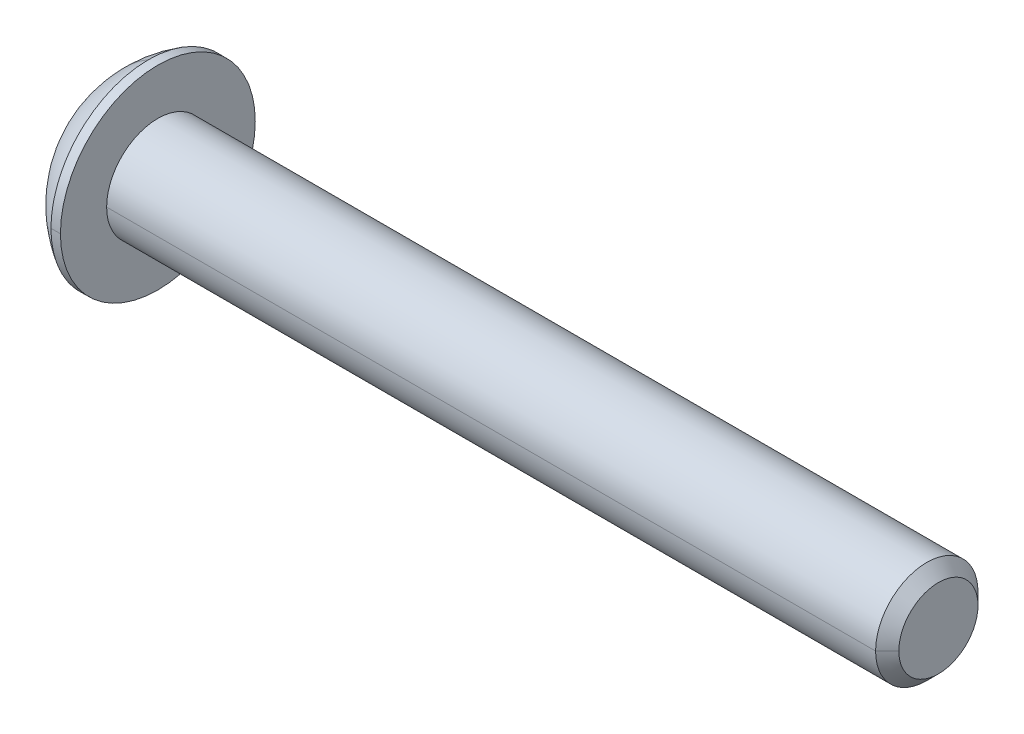
ISO-10303-21;
HEADER;
FILE_DESCRIPTION(('STEP AP214'),'2;1');
FILE_NAME('part.step','',(''),(''),'','','');
FILE_SCHEMA(('AUTOMOTIVE_DESIGN { 1 0 10303 214 1 1 1 1 }'));
ENDSEC;
DATA;
#1=APPLICATION_CONTEXT('core data for automotive mechanical design processes');
#2=APPLICATION_PROTOCOL_DEFINITION('international standard','automotive_design',2000,#1);
#3=PRODUCT_CONTEXT('',#1,'mechanical');
#4=PRODUCT('Part','Part','',(#3));
#5=PRODUCT_RELATED_PRODUCT_CATEGORY('part','',(#4));
#6=PRODUCT_DEFINITION_FORMATION('','',#4);
#7=PRODUCT_DEFINITION_CONTEXT('part definition',#1,'design');
#8=PRODUCT_DEFINITION('design','',#6,#7);
#9=PRODUCT_DEFINITION_SHAPE('','',#8);
#10=(LENGTH_UNIT() NAMED_UNIT(*) SI_UNIT(.MILLI.,.METRE.));
#11=(NAMED_UNIT(*) PLANE_ANGLE_UNIT() SI_UNIT($,.RADIAN.));
#12=(NAMED_UNIT(*) SI_UNIT($,.STERADIAN.) SOLID_ANGLE_UNIT());
#13=UNCERTAINTY_MEASURE_WITH_UNIT(LENGTH_MEASURE(1.E-05),#10,'distance_accuracy_value','');
#14=(GEOMETRIC_REPRESENTATION_CONTEXT(3) GLOBAL_UNCERTAINTY_ASSIGNED_CONTEXT((#13)) GLOBAL_UNIT_ASSIGNED_CONTEXT((#10,
#11,#12)) REPRESENTATION_CONTEXT('',''));
#15=CARTESIAN_POINT('',(0.,0.,0.));
#16=DIRECTION('',(0.,0.,1.));
#17=DIRECTION('',(1.,0.,0.));
#18=AXIS2_PLACEMENT_3D('',#15,#16,#17);
#19=CARTESIAN_POINT('',(-997.989959248641,0.,0.));
#20=DIRECTION('',(-1.,0.,0.));
#21=DIRECTION('',(0.,0.,1.));
#22=AXIS2_PLACEMENT_3D('',#19,#20,#21);
#23=CONICAL_SURFACE('',#22,1732.05080756886,1.0471975511966);
#24=DIRECTION('',(-0.5,0.,0.866025403784436));
#25=VECTOR('',#24,1.);
#26=CARTESIAN_POINT('',(2.01004075135859,0.,0.));
#27=LINE('',#26,#25);
#28=CARTESIAN_POINT('',(2.01004075135859,0.,0.));
#29=VERTEX_POINT('',#28);
#30=CARTESIAN_POINT('',(1.3208,0.,1.1938));
#31=VERTEX_POINT('',#30);
#32=EDGE_CURVE('E39',#29,#31,#27,.T.);
#33=ORIENTED_EDGE('',*,*,#32,.F.);
#34=DIRECTION('',(-0.5,0.,-0.866025403784436));
#35=VECTOR('',#34,1.);
#36=CARTESIAN_POINT('',(2.01004075135859,0.,0.));
#37=LINE('',#36,#35);
#38=CARTESIAN_POINT('',(1.3208,0.,-1.1938));
#39=VERTEX_POINT('',#38);
#40=EDGE_CURVE('E11',#29,#39,#37,.T.);
#41=ORIENTED_EDGE('',*,*,#40,.T.);
#42=CARTESIAN_POINT('',(1.3208,0.,0.));
#43=DIRECTION('',(-1.,0.,0.));
#44=DIRECTION('',(0.,0.,1.));
#45=AXIS2_PLACEMENT_3D('',#42,#43,#44);
#46=CIRCLE('',#45,1.1938);
#47=CARTESIAN_POINT('',(1.3208,-1.03386112703786,-0.5969));
#48=VERTEX_POINT('',#47);
#49=EDGE_CURVE('E26',#39,#48,#46,.T.);
#50=ORIENTED_EDGE('',*,*,#49,.T.);
#51=CARTESIAN_POINT('',(1.3208,0.,0.));
#52=DIRECTION('',(-1.,0.,0.));
#53=DIRECTION('',(0.,0.,1.));
#54=AXIS2_PLACEMENT_3D('',#51,#52,#53);
#55=CIRCLE('',#54,1.1938);
#56=CARTESIAN_POINT('',(1.3208,-1.03386112703786,0.5969));
#57=VERTEX_POINT('',#56);
#58=EDGE_CURVE('E199',#48,#57,#55,.T.);
#59=ORIENTED_EDGE('',*,*,#58,.T.);
#60=CARTESIAN_POINT('',(1.3208,0.,0.));
#61=DIRECTION('',(-1.,0.,0.));
#62=DIRECTION('',(0.,0.,1.));
#63=AXIS2_PLACEMENT_3D('',#60,#61,#62);
#64=CIRCLE('',#63,1.1938);
#65=EDGE_CURVE('E196',#57,#31,#64,.T.);
#66=ORIENTED_EDGE('',*,*,#65,.T.);
#67=EDGE_LOOP('',(#33,#41,#50,#59,#66));
#68=FACE_BOUND('',#67,.T.);
#69=ADVANCED_FACE('F16',(#68),#23,.F.);
#70=CARTESIAN_POINT('',(33.9598,0.,0.));
#71=DIRECTION('',(-1.,0.,0.));
#72=DIRECTION('',(0.,0.,1.));
#73=AXIS2_PLACEMENT_3D('',#70,#71,#72);
#74=CONICAL_SURFACE('',#73,1.61036,0.785398163397453);
#75=CARTESIAN_POINT('',(33.9598,0.,0.));
#76=DIRECTION('',(-1.,0.,0.));
#77=DIRECTION('',(0.,0.,1.));
#78=AXIS2_PLACEMENT_3D('',#75,#76,#77);
#79=CIRCLE('',#78,1.61036);
#80=CARTESIAN_POINT('',(33.9598,0.,1.61036));
#81=VERTEX_POINT('',#80);
#82=CARTESIAN_POINT('',(33.9598,0.,-1.61036));
#83=VERTEX_POINT('',#82);
#84=EDGE_CURVE('E200',#81,#83,#79,.T.);
#85=ORIENTED_EDGE('',*,*,#84,.T.);
#86=DIRECTION('',(-0.707106781186544,0.,-0.707106781186552));
#87=VECTOR('',#86,1.);
#88=CARTESIAN_POINT('',(33.9598,0.,-1.61036));
#89=LINE('',#88,#87);
#90=CARTESIAN_POINT('',(33.48736,0.,-2.0828));
#91=VERTEX_POINT('',#90);
#92=EDGE_CURVE('E284',#83,#91,#89,.T.);
#93=ORIENTED_EDGE('',*,*,#92,.T.);
#94=CARTESIAN_POINT('',(33.48736,0.,0.));
#95=DIRECTION('',(-1.,0.,0.));
#96=DIRECTION('',(0.,0.,1.));
#97=AXIS2_PLACEMENT_3D('',#94,#95,#96);
#98=CIRCLE('',#97,2.0828);
#99=CARTESIAN_POINT('',(33.48736,0.,2.0828));
#100=VERTEX_POINT('',#99);
#101=EDGE_CURVE('E246',#100,#91,#98,.T.);
#102=ORIENTED_EDGE('',*,*,#101,.F.);
#103=DIRECTION('',(-0.707106781186544,0.,0.707106781186552));
#104=VECTOR('',#103,1.);
#105=CARTESIAN_POINT('',(33.9598,0.,1.61036));
#106=LINE('',#105,#104);
#107=EDGE_CURVE('E267',#81,#100,#106,.T.);
#108=ORIENTED_EDGE('',*,*,#107,.F.);
#109=EDGE_LOOP('',(#85,#93,#102,#108));
#110=FACE_BOUND('',#109,.T.);
#111=ADVANCED_FACE('F568',(#110),#74,.T.);
#112=CARTESIAN_POINT('',(0.,0.,0.));
#113=DIRECTION('',(-1.,0.,0.));
#114=DIRECTION('',(0.,0.,1.));
#115=AXIS2_PLACEMENT_3D('',#112,#113,#114);
#116=CYLINDRICAL_SURFACE('',#115,2.0828);
#117=ORIENTED_EDGE('',*,*,#101,.T.);
#118=DIRECTION('',(-1.,0.,0.));
#119=VECTOR('',#118,1.);
#120=CARTESIAN_POINT('',(0.,0.,-2.0828));
#121=LINE('',#120,#119);
#122=CARTESIAN_POINT('',(2.2098,0.,-2.0828));
#123=VERTEX_POINT('',#122);
#124=EDGE_CURVE('E242',#91,#123,#121,.T.);
#125=ORIENTED_EDGE('',*,*,#124,.T.);
#126=CARTESIAN_POINT('',(2.2098,0.,0.));
#127=DIRECTION('',(-1.,0.,0.));
#128=DIRECTION('',(0.,0.,1.));
#129=AXIS2_PLACEMENT_3D('',#126,#127,#128);
#130=CIRCLE('',#129,2.0828);
#131=CARTESIAN_POINT('',(2.2098,0.,2.0828));
#132=VERTEX_POINT('',#131);
#133=EDGE_CURVE('E238',#132,#123,#130,.T.);
#134=ORIENTED_EDGE('',*,*,#133,.F.);
#135=DIRECTION('',(-1.,0.,0.));
#136=VECTOR('',#135,1.);
#137=CARTESIAN_POINT('',(0.,0.,2.0828));
#138=LINE('',#137,#136);
#139=EDGE_CURVE('E266',#100,#132,#138,.T.);
#140=ORIENTED_EDGE('',*,*,#139,.F.);
#141=EDGE_LOOP('',(#117,#125,#134,#140));
#142=FACE_BOUND('',#141,.T.);
#143=ADVANCED_FACE('F563',(#142),#116,.T.);
#144=CARTESIAN_POINT('',(0.,0.,0.));
#145=DIRECTION('',(-1.,0.,0.));
#146=DIRECTION('',(0.,0.,1.));
#147=AXIS2_PLACEMENT_3D('',#144,#145,#146);
#148=CYLINDRICAL_SURFACE('',#147,3.9624);
#149=CARTESIAN_POINT('',(2.2098,0.,0.));
#150=DIRECTION('',(-1.,0.,0.));
#151=DIRECTION('',(0.,0.,1.));
#152=AXIS2_PLACEMENT_3D('',#149,#150,#151);
#153=CIRCLE('',#152,3.9624);
#154=CARTESIAN_POINT('',(2.2098,0.,3.9624));
#155=VERTEX_POINT('',#154);
#156=CARTESIAN_POINT('',(2.2098,0.,-3.9624));
#157=VERTEX_POINT('',#156);
#158=EDGE_CURVE('E247',#155,#157,#153,.T.);
#159=ORIENTED_EDGE('',*,*,#158,.T.);
#160=DIRECTION('',(-1.,0.,0.));
#161=VECTOR('',#160,1.);
#162=CARTESIAN_POINT('',(0.,0.,-3.9624));
#163=LINE('',#162,#161);
#164=CARTESIAN_POINT('',(1.8288,0.,-3.9624));
#165=VERTEX_POINT('',#164);
#166=EDGE_CURVE('E275',#157,#165,#163,.T.);
#167=ORIENTED_EDGE('',*,*,#166,.T.);
#168=CARTESIAN_POINT('',(1.8288,0.,0.));
#169=DIRECTION('',(-1.,0.,0.));
#170=DIRECTION('',(0.,0.,1.));
#171=AXIS2_PLACEMENT_3D('',#168,#169,#170);
#172=CIRCLE('',#171,3.9624);
#173=CARTESIAN_POINT('',(1.8288,3.9624,0.));
#174=VERTEX_POINT('',#173);
#175=EDGE_CURVE('E272',#174,#165,#172,.T.);
#176=ORIENTED_EDGE('',*,*,#175,.F.);
#177=CARTESIAN_POINT('',(1.8288,0.,0.));
#178=DIRECTION('',(-1.,0.,0.));
#179=DIRECTION('',(0.,0.,1.));
#180=AXIS2_PLACEMENT_3D('',#177,#178,#179);
#181=CIRCLE('',#180,3.9624);
#182=CARTESIAN_POINT('',(1.8288,0.,3.9624));
#183=VERTEX_POINT('',#182);
#184=EDGE_CURVE('E259',#183,#174,#181,.T.);
#185=ORIENTED_EDGE('',*,*,#184,.F.);
#186=DIRECTION('',(-1.,0.,0.));
#187=VECTOR('',#186,1.);
#188=CARTESIAN_POINT('',(0.,0.,3.9624));
#189=LINE('',#188,#187);
#190=EDGE_CURVE('E226',#155,#183,#189,.T.);
#191=ORIENTED_EDGE('',*,*,#190,.F.);
#192=EDGE_LOOP('',(#159,#167,#176,#185,#191));
#193=FACE_BOUND('',#192,.T.);
#194=ADVANCED_FACE('F303',(#193),#148,.T.);
#195=CARTESIAN_POINT('',(4.13385,0.,0.));
#196=DIRECTION('',(0.,0.,-1.));
#197=DIRECTION('',(0.,1.,0.));
#198=AXIS2_PLACEMENT_3D('',#195,#196,#197);
#199=SPHERICAL_SURFACE('',#198,4.5840887057844);
#200=ORIENTED_EDGE('',*,*,#175,.T.);
#201=CARTESIAN_POINT('',(1.8288,0.,0.));
#202=DIRECTION('',(-1.,0.,0.));
#203=DIRECTION('',(0.,0.,1.));
#204=AXIS2_PLACEMENT_3D('',#201,#202,#203);
#205=CIRCLE('',#204,3.9624);
#206=CARTESIAN_POINT('',(1.8288,-3.9624,0.));
#207=VERTEX_POINT('',#206);
#208=EDGE_CURVE('E276',#165,#207,#205,.T.);
#209=ORIENTED_EDGE('',*,*,#208,.T.);
#210=CARTESIAN_POINT('',(4.13385,0.,0.));
#211=DIRECTION('',(0.,0.,-1.));
#212=DIRECTION('',(0.,1.,0.));
#213=AXIS2_PLACEMENT_3D('',#210,#211,#212);
#214=CIRCLE('',#213,4.5840887057844);
#215=CARTESIAN_POINT('',(0.,-1.9812,0.));
#216=VERTEX_POINT('',#215);
#217=EDGE_CURVE('E308',#207,#216,#214,.T.);
#218=ORIENTED_EDGE('',*,*,#217,.T.);
#219=CARTESIAN_POINT('',(0.,0.,0.));
#220=DIRECTION('',(-1.,0.,0.));
#221=DIRECTION('',(0.,0.,1.));
#222=AXIS2_PLACEMENT_3D('',#219,#220,#221);
#223=CIRCLE('',#222,1.9812);
#224=CARTESIAN_POINT('',(0.,1.9812,0.));
#225=VERTEX_POINT('',#224);
#226=EDGE_CURVE('E112',#225,#216,#223,.T.);
#227=ORIENTED_EDGE('',*,*,#226,.F.);
#228=CARTESIAN_POINT('',(4.13385,0.,0.));
#229=DIRECTION('',(0.,0.,1.));
#230=DIRECTION('',(1.,0.,0.));
#231=AXIS2_PLACEMENT_3D('',#228,#229,#230);
#232=CIRCLE('',#231,4.5840887057844);
#233=EDGE_CURVE('E102',#174,#225,#232,.T.);
#234=ORIENTED_EDGE('',*,*,#233,.F.);
#235=EDGE_LOOP('',(#200,#209,#218,#227,#234));
#236=FACE_BOUND('',#235,.T.);
#237=ADVANCED_FACE('F313',(#236),#199,.T.);
#238=CARTESIAN_POINT('',(0.,0.,0.));
#239=DIRECTION('',(-1.,0.,0.));
#240=DIRECTION('',(0.,0.,1.));
#241=AXIS2_PLACEMENT_3D('',#238,#239,#240);
#242=PLANE('',#241);
#243=ORIENTED_EDGE('',*,*,#226,.T.);
#244=CARTESIAN_POINT('',(0.,0.,0.));
#245=DIRECTION('',(-1.,0.,0.));
#246=DIRECTION('',(0.,0.,1.));
#247=AXIS2_PLACEMENT_3D('',#244,#245,#246);
#248=CIRCLE('',#247,1.9812);
#249=EDGE_CURVE('E248',#216,#225,#248,.T.);
#250=ORIENTED_EDGE('',*,*,#249,.T.);
#251=EDGE_LOOP('',(#243,#250));
#252=FACE_BOUND('',#251,.T.);
#253=DIRECTION('',(0.,-1.,0.));
#254=VECTOR('',#253,1.);
#255=CARTESIAN_POINT('',(0.,-0.689240751358575,1.1938));
#256=LINE('',#255,#254);
#257=CARTESIAN_POINT('',(0.,0.689240751358575,1.1938));
#258=VERTEX_POINT('',#257);
#259=CARTESIAN_POINT('',(0.,-0.689240751358575,1.1938));
#260=VERTEX_POINT('',#259);
#261=EDGE_CURVE('E170',#258,#260,#256,.T.);
#262=ORIENTED_EDGE('',*,*,#261,.T.);
#263=DIRECTION('',(0.,-0.5,-0.866025403784439));
#264=VECTOR('',#263,1.);
#265=CARTESIAN_POINT('',(0.,-1.37848150271715,0.));
#266=LINE('',#265,#264);
#267=CARTESIAN_POINT('',(0.,-1.37848150271715,0.));
#268=VERTEX_POINT('',#267);
#269=EDGE_CURVE('E220',#260,#268,#266,.T.);
#270=ORIENTED_EDGE('',*,*,#269,.T.);
#271=DIRECTION('',(0.,0.5,-0.866025403784439));
#272=VECTOR('',#271,1.);
#273=CARTESIAN_POINT('',(0.,-0.689240751358575,-1.1938));
#274=LINE('',#273,#272);
#275=CARTESIAN_POINT('',(0.,-0.689240751358575,-1.1938));
#276=VERTEX_POINT('',#275);
#277=EDGE_CURVE('E216',#268,#276,#274,.T.);
#278=ORIENTED_EDGE('',*,*,#277,.T.);
#279=DIRECTION('',(0.,1.,0.));
#280=VECTOR('',#279,1.);
#281=CARTESIAN_POINT('',(0.,0.689240751358575,-1.1938));
#282=LINE('',#281,#280);
#283=CARTESIAN_POINT('',(0.,0.689240751358575,-1.1938));
#284=VERTEX_POINT('',#283);
#285=EDGE_CURVE('E221',#276,#284,#282,.T.);
#286=ORIENTED_EDGE('',*,*,#285,.T.);
#287=DIRECTION('',(0.,0.5,0.866025403784439));
#288=VECTOR('',#287,1.);
#289=CARTESIAN_POINT('',(0.,1.37848150271715,0.));
#290=LINE('',#289,#288);
#291=CARTESIAN_POINT('',(0.,1.37848150271715,0.));
#292=VERTEX_POINT('',#291);
#293=EDGE_CURVE('E283',#284,#292,#290,.T.);
#294=ORIENTED_EDGE('',*,*,#293,.T.);
#295=DIRECTION('',(0.,-0.5,0.866025403784439));
#296=VECTOR('',#295,1.);
#297=CARTESIAN_POINT('',(0.,0.689240751358575,1.1938));
#298=LINE('',#297,#296);
#299=EDGE_CURVE('E258',#292,#258,#298,.T.);
#300=ORIENTED_EDGE('',*,*,#299,.T.);
#301=EDGE_LOOP('',(#262,#270,#278,#286,#294,#300));
#302=FACE_BOUND('',#301,.T.);
#303=ADVANCED_FACE('F373',(#252,#302),#242,.T.);
#304=CARTESIAN_POINT('',(4.13385,0.,0.));
#305=DIRECTION('',(0.,0.,-1.));
#306=DIRECTION('',(0.,1.,0.));
#307=AXIS2_PLACEMENT_3D('',#304,#305,#306);
#308=SPHERICAL_SURFACE('',#307,4.5840887057844);
#309=ORIENTED_EDGE('',*,*,#217,.F.);
#310=CARTESIAN_POINT('',(1.8288,0.,0.));
#311=DIRECTION('',(-1.,0.,0.));
#312=DIRECTION('',(0.,0.,1.));
#313=AXIS2_PLACEMENT_3D('',#310,#311,#312);
#314=CIRCLE('',#313,3.9624);
#315=EDGE_CURVE('E254',#207,#183,#314,.T.);
#316=ORIENTED_EDGE('',*,*,#315,.T.);
#317=ORIENTED_EDGE('',*,*,#184,.T.);
#318=ORIENTED_EDGE('',*,*,#233,.T.);
#319=ORIENTED_EDGE('',*,*,#249,.F.);
#320=EDGE_LOOP('',(#309,#316,#317,#318,#319));
#321=FACE_BOUND('',#320,.T.);
#322=ADVANCED_FACE('F307',(#321),#308,.T.);
#323=CARTESIAN_POINT('',(0.,0.,0.));
#324=DIRECTION('',(-1.,0.,0.));
#325=DIRECTION('',(0.,0.,1.));
#326=AXIS2_PLACEMENT_3D('',#323,#324,#325);
#327=CYLINDRICAL_SURFACE('',#326,3.9624);
#328=ORIENTED_EDGE('',*,*,#166,.F.);
#329=CARTESIAN_POINT('',(2.2098,0.,0.));
#330=DIRECTION('',(-1.,0.,0.));
#331=DIRECTION('',(0.,0.,1.));
#332=AXIS2_PLACEMENT_3D('',#329,#330,#331);
#333=CIRCLE('',#332,3.9624);
#334=EDGE_CURVE('E222',#157,#155,#333,.T.);
#335=ORIENTED_EDGE('',*,*,#334,.T.);
#336=ORIENTED_EDGE('',*,*,#190,.T.);
#337=ORIENTED_EDGE('',*,*,#315,.F.);
#338=ORIENTED_EDGE('',*,*,#208,.F.);
#339=EDGE_LOOP('',(#328,#335,#336,#337,#338));
#340=FACE_BOUND('',#339,.T.);
#341=ADVANCED_FACE('F296',(#340),#327,.T.);
#342=CARTESIAN_POINT('',(2.2098,2.0828,0.));
#343=DIRECTION('',(-1.,0.,0.));
#344=DIRECTION('',(0.,0.,1.));
#345=AXIS2_PLACEMENT_3D('',#342,#343,#344);
#346=PLANE('',#345);
#347=ORIENTED_EDGE('',*,*,#158,.F.);
#348=ORIENTED_EDGE('',*,*,#334,.F.);
#349=EDGE_LOOP('',(#347,#348));
#350=FACE_BOUND('',#349,.T.);
#351=ORIENTED_EDGE('',*,*,#133,.T.);
#352=CARTESIAN_POINT('',(2.2098,0.,0.));
#353=DIRECTION('',(-1.,0.,0.));
#354=DIRECTION('',(0.,0.,1.));
#355=AXIS2_PLACEMENT_3D('',#352,#353,#354);
#356=CIRCLE('',#355,2.0828);
#357=EDGE_CURVE('E241',#123,#132,#356,.T.);
#358=ORIENTED_EDGE('',*,*,#357,.T.);
#359=EDGE_LOOP('',(#351,#358));
#360=FACE_BOUND('',#359,.T.);
#361=ADVANCED_FACE('F554',(#350,#360),#346,.F.);
#362=CARTESIAN_POINT('',(0.,0.,0.));
#363=DIRECTION('',(-1.,0.,0.));
#364=DIRECTION('',(0.,0.,1.));
#365=AXIS2_PLACEMENT_3D('',#362,#363,#364);
#366=CYLINDRICAL_SURFACE('',#365,2.0828);
#367=ORIENTED_EDGE('',*,*,#124,.F.);
#368=CARTESIAN_POINT('',(33.48736,0.,0.));
#369=DIRECTION('',(-1.,0.,0.));
#370=DIRECTION('',(0.,0.,1.));
#371=AXIS2_PLACEMENT_3D('',#368,#369,#370);
#372=CIRCLE('',#371,2.0828);
#373=EDGE_CURVE('E332',#91,#100,#372,.T.);
#374=ORIENTED_EDGE('',*,*,#373,.T.);
#375=ORIENTED_EDGE('',*,*,#139,.T.);
#376=ORIENTED_EDGE('',*,*,#357,.F.);
#377=EDGE_LOOP('',(#367,#374,#375,#376));
#378=FACE_BOUND('',#377,.T.);
#379=ADVANCED_FACE('F557',(#378),#366,.T.);
#380=CARTESIAN_POINT('',(33.9598,0.,0.));
#381=DIRECTION('',(-1.,0.,0.));
#382=DIRECTION('',(0.,0.,1.));
#383=AXIS2_PLACEMENT_3D('',#380,#381,#382);
#384=CONICAL_SURFACE('',#383,1.61036,0.785398163397453);
#385=ORIENTED_EDGE('',*,*,#92,.F.);
#386=CARTESIAN_POINT('',(33.9598,0.,0.));
#387=DIRECTION('',(-1.,0.,0.));
#388=DIRECTION('',(0.,0.,1.));
#389=AXIS2_PLACEMENT_3D('',#386,#387,#388);
#390=CIRCLE('',#389,1.61036);
#391=EDGE_CURVE('E263',#83,#81,#390,.T.);
#392=ORIENTED_EDGE('',*,*,#391,.T.);
#393=ORIENTED_EDGE('',*,*,#107,.T.);
#394=ORIENTED_EDGE('',*,*,#373,.F.);
#395=EDGE_LOOP('',(#385,#392,#393,#394));
#396=FACE_BOUND('',#395,.T.);
#397=ADVANCED_FACE('F783',(#396),#384,.T.);
#398=CARTESIAN_POINT('',(33.9598,0.,0.));
#399=DIRECTION('',(-1.,0.,0.));
#400=DIRECTION('',(0.,0.,1.));
#401=AXIS2_PLACEMENT_3D('',#398,#399,#400);
#402=PLANE('',#401);
#403=ORIENTED_EDGE('',*,*,#84,.F.);
#404=ORIENTED_EDGE('',*,*,#391,.F.);
#405=EDGE_LOOP('',(#403,#404));
#406=FACE_BOUND('',#405,.T.);
#407=ADVANCED_FACE('F786',(#406),#402,.F.);
#408=CARTESIAN_POINT('',(1.3208,-1.37848150271715,0.));
#409=DIRECTION('',(0.,0.866025403784439,-0.5));
#410=DIRECTION('',(-1.,0.,0.));
#411=AXIS2_PLACEMENT_3D('',#408,#409,#410);
#412=PLANE('',#411);
#413=DIRECTION('',(0.,-0.5,-0.866025403784439));
#414=VECTOR('',#413,1.);
#415=CARTESIAN_POINT('',(1.3208,-1.37848150271715,0.));
#416=LINE('',#415,#414);
#417=CARTESIAN_POINT('',(1.3208,-0.689240751358575,1.1938));
#418=VERTEX_POINT('',#417);
#419=EDGE_CURVE('E194',#418,#57,#416,.T.);
#420=ORIENTED_EDGE('',*,*,#419,.T.);
#421=DIRECTION('',(0.,-0.5,-0.866025403784439));
#422=VECTOR('',#421,1.);
#423=CARTESIAN_POINT('',(1.3208,-1.37848150271715,0.));
#424=LINE('',#423,#422);
#425=CARTESIAN_POINT('',(1.3208,-1.37848150271715,0.));
#426=VERTEX_POINT('',#425);
#427=EDGE_CURVE('E214',#57,#426,#424,.T.);
#428=ORIENTED_EDGE('',*,*,#427,.T.);
#429=DIRECTION('',(-1.,0.,0.));
#430=VECTOR('',#429,1.);
#431=CARTESIAN_POINT('',(1.3208,-1.37848150271715,0.));
#432=LINE('',#431,#430);
#433=EDGE_CURVE('E210',#426,#268,#432,.T.);
#434=ORIENTED_EDGE('',*,*,#433,.T.);
#435=ORIENTED_EDGE('',*,*,#269,.F.);
#436=DIRECTION('',(-1.,0.,0.));
#437=VECTOR('',#436,1.);
#438=CARTESIAN_POINT('',(1.3208,-0.689240751358575,1.1938));
#439=LINE('',#438,#437);
#440=EDGE_CURVE('E190',#418,#260,#439,.T.);
#441=ORIENTED_EDGE('',*,*,#440,.F.);
#442=EDGE_LOOP('',(#420,#428,#434,#435,#441));
#443=FACE_BOUND('',#442,.T.);
#444=ADVANCED_FACE('F788',(#443),#412,.T.);
#445=CARTESIAN_POINT('',(1.3208,-0.689240751358575,-1.1938));
#446=DIRECTION('',(0.,0.866025403784439,0.5));
#447=DIRECTION('',(1.,0.,0.));
#448=AXIS2_PLACEMENT_3D('',#445,#446,#447);
#449=PLANE('',#448);
#450=DIRECTION('',(0.,0.5,-0.866025403784439));
#451=VECTOR('',#450,1.);
#452=CARTESIAN_POINT('',(1.3208,-0.689240751358575,-1.1938));
#453=LINE('',#452,#451);
#454=EDGE_CURVE('E215',#426,#48,#453,.T.);
#455=ORIENTED_EDGE('',*,*,#454,.T.);
#456=DIRECTION('',(0.,0.5,-0.866025403784439));
#457=VECTOR('',#456,1.);
#458=CARTESIAN_POINT('',(1.3208,-0.689240751358575,-1.1938));
#459=LINE('',#458,#457);
#460=CARTESIAN_POINT('',(1.3208,-0.689240751358575,-1.1938));
#461=VERTEX_POINT('',#460);
#462=EDGE_CURVE('E233',#48,#461,#459,.T.);
#463=ORIENTED_EDGE('',*,*,#462,.T.);
#464=DIRECTION('',(-1.,0.,0.));
#465=VECTOR('',#464,1.);
#466=CARTESIAN_POINT('',(1.3208,-0.689240751358575,-1.1938));
#467=LINE('',#466,#465);
#468=EDGE_CURVE('E237',#461,#276,#467,.T.);
#469=ORIENTED_EDGE('',*,*,#468,.T.);
#470=ORIENTED_EDGE('',*,*,#277,.F.);
#471=ORIENTED_EDGE('',*,*,#433,.F.);
#472=EDGE_LOOP('',(#455,#463,#469,#470,#471));
#473=FACE_BOUND('',#472,.T.);
#474=ADVANCED_FACE('F795',(#473),#449,.T.);
#475=CARTESIAN_POINT('',(1.3208,0.689240751358575,-1.1938));
#476=DIRECTION('',(0.,0.,1.));
#477=DIRECTION('',(1.,0.,0.));
#478=AXIS2_PLACEMENT_3D('',#475,#476,#477);
#479=PLANE('',#478);
#480=DIRECTION('',(0.,1.,0.));
#481=VECTOR('',#480,1.);
#482=CARTESIAN_POINT('',(1.3208,0.689240751358575,-1.1938));
#483=LINE('',#482,#481);
#484=EDGE_CURVE('E205',#461,#39,#483,.T.);
#485=ORIENTED_EDGE('',*,*,#484,.T.);
#486=DIRECTION('',(0.,1.,0.));
#487=VECTOR('',#486,1.);
#488=CARTESIAN_POINT('',(1.3208,0.689240751358575,-1.1938));
#489=LINE('',#488,#487);
#490=CARTESIAN_POINT('',(1.3208,0.689240751358575,-1.1938));
#491=VERTEX_POINT('',#490);
#492=EDGE_CURVE('E201',#39,#491,#489,.T.);
#493=ORIENTED_EDGE('',*,*,#492,.T.);
#494=DIRECTION('',(-1.,0.,0.));
#495=VECTOR('',#494,1.);
#496=CARTESIAN_POINT('',(1.3208,0.689240751358575,-1.1938));
#497=LINE('',#496,#495);
#498=EDGE_CURVE('E206',#491,#284,#497,.T.);
#499=ORIENTED_EDGE('',*,*,#498,.T.);
#500=ORIENTED_EDGE('',*,*,#285,.F.);
#501=ORIENTED_EDGE('',*,*,#468,.F.);
#502=EDGE_LOOP('',(#485,#493,#499,#500,#501));
#503=FACE_BOUND('',#502,.T.);
#504=ADVANCED_FACE('F851',(#503),#479,.T.);
#505=CARTESIAN_POINT('',(1.3208,1.37848150271715,0.));
#506=DIRECTION('',(0.,-0.866025403784439,0.5));
#507=DIRECTION('',(-1.,0.,0.));
#508=AXIS2_PLACEMENT_3D('',#505,#506,#507);
#509=PLANE('',#508);
#510=DIRECTION('',(0.,0.5,0.866025403784439));
#511=VECTOR('',#510,1.);
#512=CARTESIAN_POINT('',(1.3208,1.37848150271715,0.));
#513=LINE('',#512,#511);
#514=CARTESIAN_POINT('',(1.3208,1.03386112703786,-0.5969));
#515=VERTEX_POINT('',#514);
#516=EDGE_CURVE('E231',#491,#515,#513,.T.);
#517=ORIENTED_EDGE('',*,*,#516,.T.);
#518=DIRECTION('',(0.,0.5,0.866025403784439));
#519=VECTOR('',#518,1.);
#520=CARTESIAN_POINT('',(1.3208,1.37848150271715,0.));
#521=LINE('',#520,#519);
#522=CARTESIAN_POINT('',(1.3208,1.37848150271715,0.));
#523=VERTEX_POINT('',#522);
#524=EDGE_CURVE('E227',#515,#523,#521,.T.);
#525=ORIENTED_EDGE('',*,*,#524,.T.);
#526=DIRECTION('',(-1.,0.,0.));
#527=VECTOR('',#526,1.);
#528=CARTESIAN_POINT('',(1.3208,1.37848150271715,0.));
#529=LINE('',#528,#527);
#530=EDGE_CURVE('E232',#523,#292,#529,.T.);
#531=ORIENTED_EDGE('',*,*,#530,.T.);
#532=ORIENTED_EDGE('',*,*,#293,.F.);
#533=ORIENTED_EDGE('',*,*,#498,.F.);
#534=EDGE_LOOP('',(#517,#525,#531,#532,#533));
#535=FACE_BOUND('',#534,.T.);
#536=ADVANCED_FACE('F849',(#535),#509,.T.);
#537=CARTESIAN_POINT('',(1.3208,0.689240751358575,1.1938));
#538=DIRECTION('',(0.,-0.866025403784439,-0.5));
#539=DIRECTION('',(0.,0.5,-0.866025403784439));
#540=AXIS2_PLACEMENT_3D('',#537,#538,#539);
#541=PLANE('',#540);
#542=DIRECTION('',(0.,-0.5,0.866025403784439));
#543=VECTOR('',#542,1.);
#544=CARTESIAN_POINT('',(1.3208,0.689240751358575,1.1938));
#545=LINE('',#544,#543);
#546=CARTESIAN_POINT('',(1.3208,1.03386112703786,0.5969));
#547=VERTEX_POINT('',#546);
#548=EDGE_CURVE('E178',#523,#547,#545,.T.);
#549=ORIENTED_EDGE('',*,*,#548,.T.);
#550=DIRECTION('',(0.,-0.5,0.866025403784439));
#551=VECTOR('',#550,1.);
#552=CARTESIAN_POINT('',(1.3208,0.689240751358575,1.1938));
#553=LINE('',#552,#551);
#554=CARTESIAN_POINT('',(1.3208,0.689240751358575,1.1938));
#555=VERTEX_POINT('',#554);
#556=EDGE_CURVE('E174',#547,#555,#553,.T.);
#557=ORIENTED_EDGE('',*,*,#556,.T.);
#558=DIRECTION('',(-1.,0.,0.));
#559=VECTOR('',#558,1.);
#560=CARTESIAN_POINT('',(1.3208,0.689240751358575,1.1938));
#561=LINE('',#560,#559);
#562=EDGE_CURVE('E162',#555,#258,#561,.T.);
#563=ORIENTED_EDGE('',*,*,#562,.T.);
#564=ORIENTED_EDGE('',*,*,#299,.F.);
#565=ORIENTED_EDGE('',*,*,#530,.F.);
#566=EDGE_LOOP('',(#549,#557,#563,#564,#565));
#567=FACE_BOUND('',#566,.T.);
#568=ADVANCED_FACE('F177',(#567),#541,.T.);
#569=CARTESIAN_POINT('',(1.3208,-0.689240751358575,1.1938));
#570=DIRECTION('',(0.,0.,-1.));
#571=DIRECTION('',(-1.,0.,0.));
#572=AXIS2_PLACEMENT_3D('',#569,#570,#571);
#573=PLANE('',#572);
#574=DIRECTION('',(0.,-1.,0.));
#575=VECTOR('',#574,1.);
#576=CARTESIAN_POINT('',(1.3208,-0.689240751358575,1.1938));
#577=LINE('',#576,#575);
#578=EDGE_CURVE('E167',#555,#31,#577,.T.);
#579=ORIENTED_EDGE('',*,*,#578,.T.);
#580=DIRECTION('',(0.,-1.,0.));
#581=VECTOR('',#580,1.);
#582=CARTESIAN_POINT('',(1.3208,-0.689240751358575,1.1938));
#583=LINE('',#582,#581);
#584=EDGE_CURVE('E185',#31,#418,#583,.T.);
#585=ORIENTED_EDGE('',*,*,#584,.T.);
#586=ORIENTED_EDGE('',*,*,#440,.T.);
#587=ORIENTED_EDGE('',*,*,#261,.F.);
#588=ORIENTED_EDGE('',*,*,#562,.F.);
#589=EDGE_LOOP('',(#579,#585,#586,#587,#588));
#590=FACE_BOUND('',#589,.T.);
#591=ADVANCED_FACE('F164',(#590),#573,.T.);
#592=CARTESIAN_POINT('',(1.3208,-2.06772225407573,-1.1938));
#593=DIRECTION('',(1.,0.,0.));
#594=DIRECTION('',(0.,1.,0.));
#595=AXIS2_PLACEMENT_3D('',#592,#593,#594);
#596=PLANE('',#595);
#597=CARTESIAN_POINT('',(1.3208,0.,0.));
#598=DIRECTION('',(-1.,0.,0.));
#599=DIRECTION('',(0.,0.,1.));
#600=AXIS2_PLACEMENT_3D('',#597,#598,#599);
#601=CIRCLE('',#600,1.1938);
#602=EDGE_CURVE('E209',#515,#39,#601,.T.);
#603=ORIENTED_EDGE('',*,*,#602,.F.);
#604=ORIENTED_EDGE('',*,*,#516,.F.);
#605=ORIENTED_EDGE('',*,*,#492,.F.);
#606=EDGE_LOOP('',(#603,#604,#605));
#607=FACE_BOUND('',#606,.T.);
#608=ADVANCED_FACE('F865',(#607),#596,.F.);
#609=CARTESIAN_POINT('',(1.3208,-2.06772225407573,-1.1938));
#610=DIRECTION('',(1.,0.,0.));
#611=DIRECTION('',(0.,1.,0.));
#612=AXIS2_PLACEMENT_3D('',#609,#610,#611);
#613=PLANE('',#612);
#614=CARTESIAN_POINT('',(1.3208,0.,0.));
#615=DIRECTION('',(-1.,0.,0.));
#616=DIRECTION('',(0.,0.,1.));
#617=AXIS2_PLACEMENT_3D('',#614,#615,#616);
#618=CIRCLE('',#617,1.1938);
#619=EDGE_CURVE('E152',#547,#515,#618,.T.);
#620=ORIENTED_EDGE('',*,*,#619,.F.);
#621=ORIENTED_EDGE('',*,*,#548,.F.);
#622=ORIENTED_EDGE('',*,*,#524,.F.);
#623=EDGE_LOOP('',(#620,#621,#622));
#624=FACE_BOUND('',#623,.T.);
#625=ADVANCED_FACE('F841',(#624),#613,.F.);
#626=CARTESIAN_POINT('',(1.3208,-2.06772225407573,-1.1938));
#627=DIRECTION('',(1.,0.,0.));
#628=DIRECTION('',(0.,1.,0.));
#629=AXIS2_PLACEMENT_3D('',#626,#627,#628);
#630=PLANE('',#629);
#631=CARTESIAN_POINT('',(1.3208,0.,0.));
#632=DIRECTION('',(-1.,0.,0.));
#633=DIRECTION('',(0.,0.,1.));
#634=AXIS2_PLACEMENT_3D('',#631,#632,#633);
#635=CIRCLE('',#634,1.1938);
#636=EDGE_CURVE('E19',#31,#547,#635,.T.);
#637=ORIENTED_EDGE('',*,*,#636,.F.);
#638=ORIENTED_EDGE('',*,*,#578,.F.);
#639=ORIENTED_EDGE('',*,*,#556,.F.);
#640=EDGE_LOOP('',(#637,#638,#639));
#641=FACE_BOUND('',#640,.T.);
#642=ADVANCED_FACE('F183',(#641),#630,.F.);
#643=CARTESIAN_POINT('',(1.3208,-2.06772225407573,-1.1938));
#644=DIRECTION('',(1.,0.,0.));
#645=DIRECTION('',(0.,1.,0.));
#646=AXIS2_PLACEMENT_3D('',#643,#644,#645);
#647=PLANE('',#646);
#648=ORIENTED_EDGE('',*,*,#65,.F.);
#649=ORIENTED_EDGE('',*,*,#419,.F.);
#650=ORIENTED_EDGE('',*,*,#584,.F.);
#651=EDGE_LOOP('',(#648,#649,#650));
#652=FACE_BOUND('',#651,.T.);
#653=ADVANCED_FACE('F834',(#652),#647,.F.);
#654=CARTESIAN_POINT('',(1.3208,-2.06772225407573,-1.1938));
#655=DIRECTION('',(1.,0.,0.));
#656=DIRECTION('',(0.,1.,0.));
#657=AXIS2_PLACEMENT_3D('',#654,#655,#656);
#658=PLANE('',#657);
#659=ORIENTED_EDGE('',*,*,#58,.F.);
#660=ORIENTED_EDGE('',*,*,#454,.F.);
#661=ORIENTED_EDGE('',*,*,#427,.F.);
#662=EDGE_LOOP('',(#659,#660,#661));
#663=FACE_BOUND('',#662,.T.);
#664=ADVANCED_FACE('F817',(#663),#658,.F.);
#665=CARTESIAN_POINT('',(1.3208,-2.06772225407573,-1.1938));
#666=DIRECTION('',(1.,0.,0.));
#667=DIRECTION('',(0.,1.,0.));
#668=AXIS2_PLACEMENT_3D('',#665,#666,#667);
#669=PLANE('',#668);
#670=ORIENTED_EDGE('',*,*,#49,.F.);
#671=ORIENTED_EDGE('',*,*,#484,.F.);
#672=ORIENTED_EDGE('',*,*,#462,.F.);
#673=EDGE_LOOP('',(#670,#671,#672));
#674=FACE_BOUND('',#673,.T.);
#675=ADVANCED_FACE('F813',(#674),#669,.F.);
#676=CARTESIAN_POINT('',(-997.989959248641,0.,0.));
#677=DIRECTION('',(-1.,0.,0.));
#678=DIRECTION('',(0.,0.,1.));
#679=AXIS2_PLACEMENT_3D('',#676,#677,#678);
#680=CONICAL_SURFACE('',#679,1732.05080756886,1.0471975511966);
#681=ORIENTED_EDGE('',*,*,#40,.F.);
#682=ORIENTED_EDGE('',*,*,#32,.T.);
#683=ORIENTED_EDGE('',*,*,#636,.T.);
#684=ORIENTED_EDGE('',*,*,#619,.T.);
#685=ORIENTED_EDGE('',*,*,#602,.T.);
#686=EDGE_LOOP('',(#681,#682,#683,#684,#685));
#687=FACE_BOUND('',#686,.T.);
#688=ADVANCED_FACE('F816',(#687),#680,.F.);
#689=CLOSED_SHELL('',(#69,#111,#143,#194,#237,#303,#322,#341,#361,#379,#397,#407,#444,#474,#504,
#536,#568,#591,#608,#625,#642,#653,#664,#675,#688));
#690=MANIFOLD_SOLID_BREP('B1',#689);
#691=ADVANCED_BREP_SHAPE_REPRESENTATION('',(#18,#690),#14);
#692=SHAPE_DEFINITION_REPRESENTATION(#9,#691);
ENDSEC;
END-ISO-10303-21;
